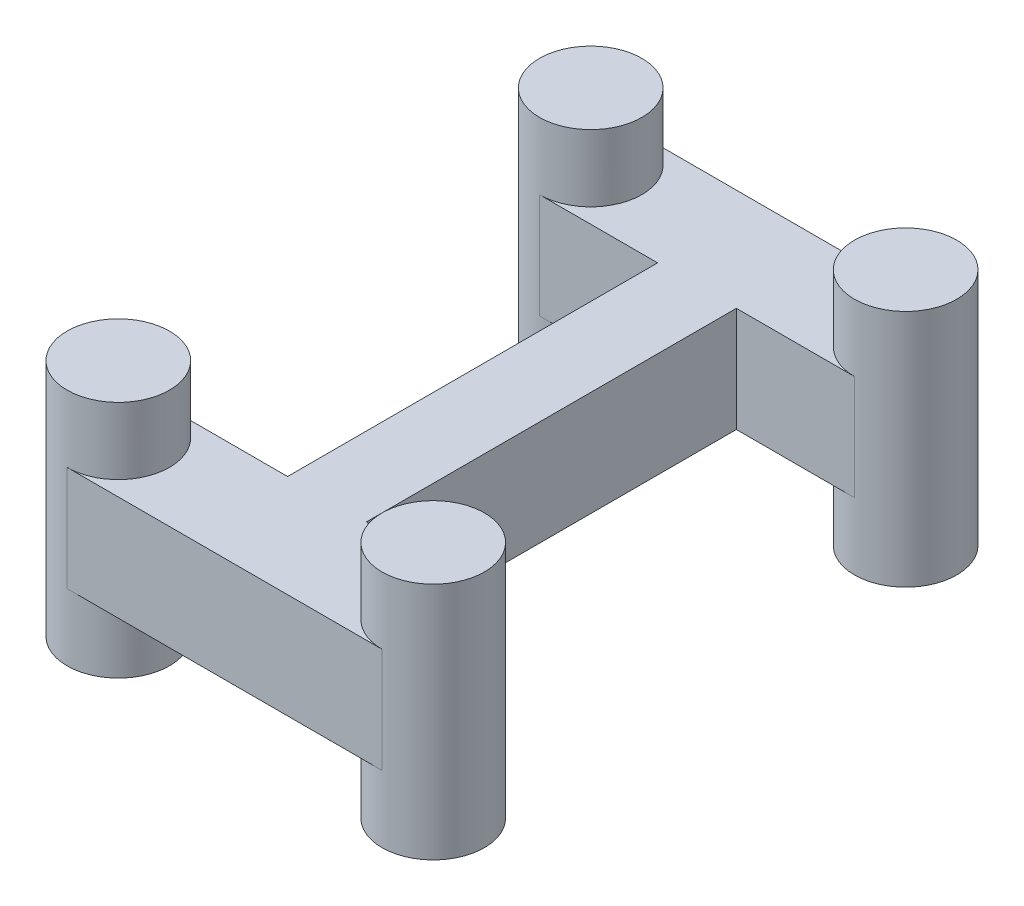
ISO-10303-21;
HEADER;
FILE_DESCRIPTION(('STEP AP214'),'2;1');
FILE_NAME('part.step','',(''),(''),'','','');
FILE_SCHEMA(('AUTOMOTIVE_DESIGN { 1 0 10303 214 1 1 1 1 }'));
ENDSEC;
DATA;
#1=APPLICATION_CONTEXT('core data for automotive mechanical design processes');
#2=APPLICATION_PROTOCOL_DEFINITION('international standard','automotive_design',2000,#1);
#3=PRODUCT_CONTEXT('',#1,'mechanical');
#4=PRODUCT('Part','Part','',(#3));
#5=PRODUCT_RELATED_PRODUCT_CATEGORY('part','',(#4));
#6=PRODUCT_DEFINITION_FORMATION('','',#4);
#7=PRODUCT_DEFINITION_CONTEXT('part definition',#1,'design');
#8=PRODUCT_DEFINITION('design','',#6,#7);
#9=PRODUCT_DEFINITION_SHAPE('','',#8);
#10=(LENGTH_UNIT() NAMED_UNIT(*) SI_UNIT(.MILLI.,.METRE.));
#11=(NAMED_UNIT(*) PLANE_ANGLE_UNIT() SI_UNIT($,.RADIAN.));
#12=(NAMED_UNIT(*) SI_UNIT($,.STERADIAN.) SOLID_ANGLE_UNIT());
#13=UNCERTAINTY_MEASURE_WITH_UNIT(LENGTH_MEASURE(1.E-05),#10,'distance_accuracy_value','');
#14=(GEOMETRIC_REPRESENTATION_CONTEXT(3) GLOBAL_UNCERTAINTY_ASSIGNED_CONTEXT((#13)) GLOBAL_UNIT_ASSIGNED_CONTEXT((#10,
#11,#12)) REPRESENTATION_CONTEXT('',''));
#15=CARTESIAN_POINT('',(0.,0.,0.));
#16=DIRECTION('',(0.,0.,1.));
#17=DIRECTION('',(1.,0.,0.));
#18=AXIS2_PLACEMENT_3D('',#15,#16,#17);
#19=CARTESIAN_POINT('',(0.,-2.,7.05));
#20=DIRECTION('',(0.,0.,-1.));
#21=DIRECTION('',(-1.,0.,0.));
#22=AXIS2_PLACEMENT_3D('',#19,#20,#21);
#23=PLANE('',#22);
#24=DIRECTION('',(0.,1.,0.));
#25=VECTOR('',#24,1.);
#26=CARTESIAN_POINT('',(-6.,-2.,7.05));
#27=LINE('',#26,#25);
#28=CARTESIAN_POINT('',(-6.,-2.,7.05));
#29=VERTEX_POINT('',#28);
#30=CARTESIAN_POINT('',(-6.,2.,7.05));
#31=VERTEX_POINT('',#30);
#32=EDGE_CURVE('E11',#29,#31,#27,.T.);
#33=ORIENTED_EDGE('',*,*,#32,.T.);
#34=DIRECTION('',(-1.,0.,0.));
#35=VECTOR('',#34,1.);
#36=CARTESIAN_POINT('',(0.,2.,7.05));
#37=LINE('',#36,#35);
#38=CARTESIAN_POINT('',(-1.5,2.,7.05));
#39=VERTEX_POINT('',#38);
#40=EDGE_CURVE('E189',#39,#31,#37,.T.);
#41=ORIENTED_EDGE('',*,*,#40,.F.);
#42=DIRECTION('',(0.,1.,0.));
#43=VECTOR('',#42,1.);
#44=CARTESIAN_POINT('',(-1.5,-2.,7.05));
#45=LINE('',#44,#43);
#46=CARTESIAN_POINT('',(-1.5,-2.,7.05));
#47=VERTEX_POINT('',#46);
#48=EDGE_CURVE('E51',#47,#39,#45,.T.);
#49=ORIENTED_EDGE('',*,*,#48,.F.);
#50=DIRECTION('',(-1.,0.,0.));
#51=VECTOR('',#50,1.);
#52=CARTESIAN_POINT('',(0.,-2.,7.05));
#53=LINE('',#52,#51);
#54=EDGE_CURVE('E228',#47,#29,#53,.T.);
#55=ORIENTED_EDGE('',*,*,#54,.T.);
#56=EDGE_LOOP('',(#33,#41,#49,#55));
#57=FACE_BOUND('',#56,.T.);
#58=ADVANCED_FACE('F41',(#57),#23,.T.);
#59=CARTESIAN_POINT('',(-1.5,-2.,0.));
#60=DIRECTION('',(-1.,0.,0.));
#61=DIRECTION('',(0.,0.,1.));
#62=AXIS2_PLACEMENT_3D('',#59,#60,#61);
#63=PLANE('',#62);
#64=ORIENTED_EDGE('',*,*,#48,.T.);
#65=DIRECTION('',(0.,0.,1.));
#66=VECTOR('',#65,1.);
#67=CARTESIAN_POINT('',(-1.5,2.,0.));
#68=LINE('',#67,#66);
#69=CARTESIAN_POINT('',(-1.5,2.,-7.05));
#70=VERTEX_POINT('',#69);
#71=EDGE_CURVE('E185',#70,#39,#68,.T.);
#72=ORIENTED_EDGE('',*,*,#71,.F.);
#73=DIRECTION('',(0.,1.,0.));
#74=VECTOR('',#73,1.);
#75=CARTESIAN_POINT('',(-1.5,-2.,-7.05));
#76=LINE('',#75,#74);
#77=CARTESIAN_POINT('',(-1.5,-2.,-7.05));
#78=VERTEX_POINT('',#77);
#79=EDGE_CURVE('E233',#78,#70,#76,.T.);
#80=ORIENTED_EDGE('',*,*,#79,.F.);
#81=DIRECTION('',(0.,0.,1.));
#82=VECTOR('',#81,1.);
#83=CARTESIAN_POINT('',(-1.5,-2.,0.));
#84=LINE('',#83,#82);
#85=EDGE_CURVE('E225',#78,#47,#84,.T.);
#86=ORIENTED_EDGE('',*,*,#85,.T.);
#87=EDGE_LOOP('',(#64,#72,#80,#86));
#88=FACE_BOUND('',#87,.T.);
#89=ADVANCED_FACE('F293',(#88),#63,.T.);
#90=CARTESIAN_POINT('',(0.,-2.,-7.05));
#91=DIRECTION('',(0.,0.,1.));
#92=DIRECTION('',(1.,0.,0.));
#93=AXIS2_PLACEMENT_3D('',#90,#91,#92);
#94=PLANE('',#93);
#95=ORIENTED_EDGE('',*,*,#79,.T.);
#96=DIRECTION('',(1.,0.,0.));
#97=VECTOR('',#96,1.);
#98=CARTESIAN_POINT('',(0.,2.,-7.05));
#99=LINE('',#98,#97);
#100=CARTESIAN_POINT('',(-6.,2.,-7.05));
#101=VERTEX_POINT('',#100);
#102=EDGE_CURVE('E181',#101,#70,#99,.T.);
#103=ORIENTED_EDGE('',*,*,#102,.F.);
#104=DIRECTION('',(0.,1.,0.));
#105=VECTOR('',#104,1.);
#106=CARTESIAN_POINT('',(-6.,-2.,-7.05));
#107=LINE('',#106,#105);
#108=CARTESIAN_POINT('',(-6.,-2.,-7.05));
#109=VERTEX_POINT('',#108);
#110=EDGE_CURVE('E236',#109,#101,#107,.T.);
#111=ORIENTED_EDGE('',*,*,#110,.F.);
#112=DIRECTION('',(1.,0.,0.));
#113=VECTOR('',#112,1.);
#114=CARTESIAN_POINT('',(0.,-2.,-7.05));
#115=LINE('',#114,#113);
#116=EDGE_CURVE('E221',#109,#78,#115,.T.);
#117=ORIENTED_EDGE('',*,*,#116,.T.);
#118=EDGE_LOOP('',(#95,#103,#111,#117));
#119=FACE_BOUND('',#118,.T.);
#120=ADVANCED_FACE('F290',(#119),#94,.T.);
#121=CARTESIAN_POINT('',(0.,-2.,-10.95));
#122=DIRECTION('',(0.,0.,-1.));
#123=DIRECTION('',(-1.,0.,0.));
#124=AXIS2_PLACEMENT_3D('',#121,#122,#123);
#125=PLANE('',#124);
#126=DIRECTION('',(0.,1.,0.));
#127=VECTOR('',#126,1.);
#128=CARTESIAN_POINT('',(-6.,-2.,-10.95));
#129=LINE('',#128,#127);
#130=CARTESIAN_POINT('',(-6.,-2.,-10.95));
#131=VERTEX_POINT('',#130);
#132=CARTESIAN_POINT('',(-6.,2.,-10.95));
#133=VERTEX_POINT('',#132);
#134=EDGE_CURVE('E240',#131,#133,#129,.T.);
#135=ORIENTED_EDGE('',*,*,#134,.T.);
#136=DIRECTION('',(-1.,0.,0.));
#137=VECTOR('',#136,1.);
#138=CARTESIAN_POINT('',(0.,2.,-10.95));
#139=LINE('',#138,#137);
#140=CARTESIAN_POINT('',(6.,2.,-10.95));
#141=VERTEX_POINT('',#140);
#142=EDGE_CURVE('E174',#141,#133,#139,.T.);
#143=ORIENTED_EDGE('',*,*,#142,.F.);
#144=DIRECTION('',(0.,1.,0.));
#145=VECTOR('',#144,1.);
#146=CARTESIAN_POINT('',(6.,-2.,-10.95));
#147=LINE('',#146,#145);
#148=CARTESIAN_POINT('',(6.,-2.,-10.95));
#149=VERTEX_POINT('',#148);
#150=EDGE_CURVE('E244',#149,#141,#147,.T.);
#151=ORIENTED_EDGE('',*,*,#150,.F.);
#152=DIRECTION('',(-1.,0.,0.));
#153=VECTOR('',#152,1.);
#154=CARTESIAN_POINT('',(0.,-2.,-10.95));
#155=LINE('',#154,#153);
#156=EDGE_CURVE('E214',#149,#131,#155,.T.);
#157=ORIENTED_EDGE('',*,*,#156,.T.);
#158=EDGE_LOOP('',(#135,#143,#151,#157));
#159=FACE_BOUND('',#158,.T.);
#160=ADVANCED_FACE('F284',(#159),#125,.T.);
#161=CARTESIAN_POINT('',(0.,-2.,-7.05));
#162=DIRECTION('',(0.,0.,1.));
#163=DIRECTION('',(1.,0.,0.));
#164=AXIS2_PLACEMENT_3D('',#161,#162,#163);
#165=PLANE('',#164);
#166=DIRECTION('',(0.,1.,0.));
#167=VECTOR('',#166,1.);
#168=CARTESIAN_POINT('',(6.,-2.,-7.05));
#169=LINE('',#168,#167);
#170=CARTESIAN_POINT('',(6.,-2.,-7.05));
#171=VERTEX_POINT('',#170);
#172=CARTESIAN_POINT('',(6.,2.,-7.05));
#173=VERTEX_POINT('',#172);
#174=EDGE_CURVE('E248',#171,#173,#169,.T.);
#175=ORIENTED_EDGE('',*,*,#174,.T.);
#176=DIRECTION('',(1.,0.,0.));
#177=VECTOR('',#176,1.);
#178=CARTESIAN_POINT('',(0.,2.,-7.05));
#179=LINE('',#178,#177);
#180=CARTESIAN_POINT('',(1.5,2.,-7.05));
#181=VERTEX_POINT('',#180);
#182=EDGE_CURVE('E167',#181,#173,#179,.T.);
#183=ORIENTED_EDGE('',*,*,#182,.F.);
#184=DIRECTION('',(0.,1.,0.));
#185=VECTOR('',#184,1.);
#186=CARTESIAN_POINT('',(1.5,-2.,-7.05));
#187=LINE('',#186,#185);
#188=CARTESIAN_POINT('',(1.5,-2.,-7.05));
#189=VERTEX_POINT('',#188);
#190=EDGE_CURVE('E252',#189,#181,#187,.T.);
#191=ORIENTED_EDGE('',*,*,#190,.F.);
#192=DIRECTION('',(1.,0.,0.));
#193=VECTOR('',#192,1.);
#194=CARTESIAN_POINT('',(0.,-2.,-7.05));
#195=LINE('',#194,#193);
#196=EDGE_CURVE('E207',#189,#171,#195,.T.);
#197=ORIENTED_EDGE('',*,*,#196,.T.);
#198=EDGE_LOOP('',(#175,#183,#191,#197));
#199=FACE_BOUND('',#198,.T.);
#200=ADVANCED_FACE('F274',(#199),#165,.T.);
#201=CARTESIAN_POINT('',(1.5,-2.,0.));
#202=DIRECTION('',(1.,0.,0.));
#203=DIRECTION('',(0.,0.,-1.));
#204=AXIS2_PLACEMENT_3D('',#201,#202,#203);
#205=PLANE('',#204);
#206=ORIENTED_EDGE('',*,*,#190,.T.);
#207=DIRECTION('',(0.,0.,-1.));
#208=VECTOR('',#207,1.);
#209=CARTESIAN_POINT('',(1.5,2.,0.));
#210=LINE('',#209,#208);
#211=CARTESIAN_POINT('',(1.5,2.,7.05));
#212=VERTEX_POINT('',#211);
#213=EDGE_CURVE('E160',#212,#181,#210,.T.);
#214=ORIENTED_EDGE('',*,*,#213,.F.);
#215=DIRECTION('',(0.,1.,0.));
#216=VECTOR('',#215,1.);
#217=CARTESIAN_POINT('',(1.5,-2.,7.05));
#218=LINE('',#217,#216);
#219=CARTESIAN_POINT('',(1.5,-2.,7.05));
#220=VERTEX_POINT('',#219);
#221=EDGE_CURVE('E255',#220,#212,#218,.T.);
#222=ORIENTED_EDGE('',*,*,#221,.F.);
#223=DIRECTION('',(0.,0.,-1.));
#224=VECTOR('',#223,1.);
#225=CARTESIAN_POINT('',(1.5,-2.,0.));
#226=LINE('',#225,#224);
#227=EDGE_CURVE('E203',#220,#189,#226,.T.);
#228=ORIENTED_EDGE('',*,*,#227,.T.);
#229=EDGE_LOOP('',(#206,#214,#222,#228));
#230=FACE_BOUND('',#229,.T.);
#231=ADVANCED_FACE('F272',(#230),#205,.T.);
#232=CARTESIAN_POINT('',(0.,-2.,7.05));
#233=DIRECTION('',(0.,0.,-1.));
#234=DIRECTION('',(-1.,0.,0.));
#235=AXIS2_PLACEMENT_3D('',#232,#233,#234);
#236=PLANE('',#235);
#237=ORIENTED_EDGE('',*,*,#221,.T.);
#238=DIRECTION('',(-1.,0.,0.));
#239=VECTOR('',#238,1.);
#240=CARTESIAN_POINT('',(0.,2.,7.05));
#241=LINE('',#240,#239);
#242=CARTESIAN_POINT('',(6.,2.,7.05));
#243=VERTEX_POINT('',#242);
#244=EDGE_CURVE('E157',#243,#212,#241,.T.);
#245=ORIENTED_EDGE('',*,*,#244,.F.);
#246=DIRECTION('',(0.,1.,0.));
#247=VECTOR('',#246,1.);
#248=CARTESIAN_POINT('',(6.,-2.,7.05));
#249=LINE('',#248,#247);
#250=CARTESIAN_POINT('',(6.,-2.,7.05));
#251=VERTEX_POINT('',#250);
#252=EDGE_CURVE('E154',#251,#243,#249,.T.);
#253=ORIENTED_EDGE('',*,*,#252,.F.);
#254=DIRECTION('',(-1.,0.,0.));
#255=VECTOR('',#254,1.);
#256=CARTESIAN_POINT('',(0.,-2.,7.05));
#257=LINE('',#256,#255);
#258=EDGE_CURVE('E199',#251,#220,#257,.T.);
#259=ORIENTED_EDGE('',*,*,#258,.T.);
#260=EDGE_LOOP('',(#237,#245,#253,#259));
#261=FACE_BOUND('',#260,.T.);
#262=ADVANCED_FACE('F268',(#261),#236,.T.);
#263=CARTESIAN_POINT('',(0.,-2.,10.95));
#264=DIRECTION('',(0.,0.,1.));
#265=DIRECTION('',(1.,0.,0.));
#266=AXIS2_PLACEMENT_3D('',#263,#264,#265);
#267=PLANE('',#266);
#268=DIRECTION('',(0.,1.,0.));
#269=VECTOR('',#268,1.);
#270=CARTESIAN_POINT('',(6.,-2.,10.95));
#271=LINE('',#270,#269);
#272=CARTESIAN_POINT('',(6.,-2.,10.95));
#273=VERTEX_POINT('',#272);
#274=CARTESIAN_POINT('',(6.,2.,10.95));
#275=VERTEX_POINT('',#274);
#276=EDGE_CURVE('E149',#273,#275,#271,.T.);
#277=ORIENTED_EDGE('',*,*,#276,.T.);
#278=DIRECTION('',(1.,0.,0.));
#279=VECTOR('',#278,1.);
#280=CARTESIAN_POINT('',(0.,2.,10.95));
#281=LINE('',#280,#279);
#282=CARTESIAN_POINT('',(-6.,2.,10.95));
#283=VERTEX_POINT('',#282);
#284=EDGE_CURVE('E134',#283,#275,#281,.T.);
#285=ORIENTED_EDGE('',*,*,#284,.F.);
#286=DIRECTION('',(0.,1.,0.));
#287=VECTOR('',#286,1.);
#288=CARTESIAN_POINT('',(-6.,-2.,10.95));
#289=LINE('',#288,#287);
#290=CARTESIAN_POINT('',(-6.,-2.,10.95));
#291=VERTEX_POINT('',#290);
#292=EDGE_CURVE('E45',#291,#283,#289,.T.);
#293=ORIENTED_EDGE('',*,*,#292,.F.);
#294=DIRECTION('',(1.,0.,0.));
#295=VECTOR('',#294,1.);
#296=CARTESIAN_POINT('',(0.,-2.,10.95));
#297=LINE('',#296,#295);
#298=EDGE_CURVE('E150',#291,#273,#297,.T.);
#299=ORIENTED_EDGE('',*,*,#298,.T.);
#300=EDGE_LOOP('',(#277,#285,#293,#299));
#301=FACE_BOUND('',#300,.T.);
#302=ADVANCED_FACE('F43',(#301),#267,.T.);
#303=CARTESIAN_POINT('',(0.,-2.,0.));
#304=DIRECTION('',(0.,1.,0.));
#305=DIRECTION('',(0.,0.,1.));
#306=AXIS2_PLACEMENT_3D('',#303,#304,#305);
#307=PLANE('',#306);
#308=CARTESIAN_POINT('',(-6.,-2.,9.));
#309=DIRECTION('',(0.,1.,0.));
#310=DIRECTION('',(0.,0.,1.));
#311=AXIS2_PLACEMENT_3D('',#308,#309,#310);
#312=CIRCLE('',#311,1.95);
#313=EDGE_CURVE('E59',#291,#29,#312,.T.);
#314=ORIENTED_EDGE('',*,*,#313,.T.);
#315=ORIENTED_EDGE('',*,*,#54,.F.);
#316=ORIENTED_EDGE('',*,*,#85,.F.);
#317=ORIENTED_EDGE('',*,*,#116,.F.);
#318=CARTESIAN_POINT('',(-6.,-2.,-9.));
#319=DIRECTION('',(0.,1.,0.));
#320=DIRECTION('',(0.,0.,1.));
#321=AXIS2_PLACEMENT_3D('',#318,#319,#320);
#322=CIRCLE('',#321,1.95);
#323=EDGE_CURVE('E218',#109,#131,#322,.T.);
#324=ORIENTED_EDGE('',*,*,#323,.T.);
#325=ORIENTED_EDGE('',*,*,#156,.F.);
#326=CARTESIAN_POINT('',(6.,-2.,-9.));
#327=DIRECTION('',(0.,1.,0.));
#328=DIRECTION('',(0.,0.,1.));
#329=AXIS2_PLACEMENT_3D('',#326,#327,#328);
#330=CIRCLE('',#329,1.95);
#331=EDGE_CURVE('E211',#149,#171,#330,.T.);
#332=ORIENTED_EDGE('',*,*,#331,.T.);
#333=ORIENTED_EDGE('',*,*,#196,.F.);
#334=ORIENTED_EDGE('',*,*,#227,.F.);
#335=ORIENTED_EDGE('',*,*,#258,.F.);
#336=CARTESIAN_POINT('',(6.,-2.,9.));
#337=DIRECTION('',(0.,1.,0.));
#338=DIRECTION('',(0.,0.,1.));
#339=AXIS2_PLACEMENT_3D('',#336,#337,#338);
#340=CIRCLE('',#339,1.95);
#341=EDGE_CURVE('E196',#251,#273,#340,.T.);
#342=ORIENTED_EDGE('',*,*,#341,.T.);
#343=ORIENTED_EDGE('',*,*,#298,.F.);
#344=EDGE_LOOP('',(#314,#315,#316,#317,#324,#325,#332,#333,#334,#335,#342,#343));
#345=FACE_BOUND('',#344,.T.);
#346=ADVANCED_FACE('F263',(#345),#307,.F.);
#347=CARTESIAN_POINT('',(0.,2.,0.));
#348=DIRECTION('',(0.,1.,0.));
#349=DIRECTION('',(0.,0.,1.));
#350=AXIS2_PLACEMENT_3D('',#347,#348,#349);
#351=PLANE('',#350);
#352=CARTESIAN_POINT('',(-6.,2.,9.));
#353=DIRECTION('',(0.,1.,0.));
#354=DIRECTION('',(0.,0.,1.));
#355=AXIS2_PLACEMENT_3D('',#352,#353,#354);
#356=CIRCLE('',#355,1.95);
#357=EDGE_CURVE('E142',#283,#31,#356,.T.);
#358=ORIENTED_EDGE('',*,*,#357,.F.);
#359=ORIENTED_EDGE('',*,*,#284,.T.);
#360=CARTESIAN_POINT('',(6.,2.,9.));
#361=DIRECTION('',(0.,1.,0.));
#362=DIRECTION('',(0.,0.,1.));
#363=AXIS2_PLACEMENT_3D('',#360,#361,#362);
#364=CIRCLE('',#363,1.95);
#365=EDGE_CURVE('E139',#243,#275,#364,.T.);
#366=ORIENTED_EDGE('',*,*,#365,.F.);
#367=ORIENTED_EDGE('',*,*,#244,.T.);
#368=ORIENTED_EDGE('',*,*,#213,.T.);
#369=ORIENTED_EDGE('',*,*,#182,.T.);
#370=CARTESIAN_POINT('',(6.,2.,-9.));
#371=DIRECTION('',(0.,1.,0.));
#372=DIRECTION('',(0.,0.,1.));
#373=AXIS2_PLACEMENT_3D('',#370,#371,#372);
#374=CIRCLE('',#373,1.95);
#375=EDGE_CURVE('E170',#141,#173,#374,.T.);
#376=ORIENTED_EDGE('',*,*,#375,.F.);
#377=ORIENTED_EDGE('',*,*,#142,.T.);
#378=CARTESIAN_POINT('',(-6.,2.,-9.));
#379=DIRECTION('',(0.,1.,0.));
#380=DIRECTION('',(0.,0.,1.));
#381=AXIS2_PLACEMENT_3D('',#378,#379,#380);
#382=CIRCLE('',#381,1.95);
#383=EDGE_CURVE('E177',#101,#133,#382,.T.);
#384=ORIENTED_EDGE('',*,*,#383,.F.);
#385=ORIENTED_EDGE('',*,*,#102,.T.);
#386=ORIENTED_EDGE('',*,*,#71,.T.);
#387=ORIENTED_EDGE('',*,*,#40,.T.);
#388=EDGE_LOOP('',(#358,#359,#366,#367,#368,#369,#376,#377,#384,#385,#386,#387));
#389=FACE_BOUND('',#388,.T.);
#390=ADVANCED_FACE('F136',(#389),#351,.T.);
#391=CARTESIAN_POINT('',(-6.,-4.55,-9.));
#392=DIRECTION('',(0.,1.,0.));
#393=DIRECTION('',(0.,0.,1.));
#394=AXIS2_PLACEMENT_3D('',#391,#392,#393);
#395=CYLINDRICAL_SURFACE('',#394,1.95);
#396=CARTESIAN_POINT('',(-6.,4.55,-9.));
#397=DIRECTION('',(0.,1.,0.));
#398=DIRECTION('',(0.,0.,1.));
#399=AXIS2_PLACEMENT_3D('',#396,#397,#398);
#400=CIRCLE('',#399,1.95);
#401=CARTESIAN_POINT('',(-6.,4.55,-7.05));
#402=VERTEX_POINT('',#401);
#403=EDGE_CURVE('E395',#402,#402,#400,.T.);
#404=ORIENTED_EDGE('',*,*,#403,.F.);
#405=EDGE_LOOP('',(#404));
#406=FACE_BOUND('',#405,.T.);
#407=CARTESIAN_POINT('',(-6.,-4.55,-9.));
#408=DIRECTION('',(0.,1.,0.));
#409=DIRECTION('',(0.,0.,1.));
#410=AXIS2_PLACEMENT_3D('',#407,#408,#409);
#411=CIRCLE('',#410,1.95);
#412=CARTESIAN_POINT('',(-6.,-4.55,-7.05));
#413=VERTEX_POINT('',#412);
#414=EDGE_CURVE('E399',#413,#413,#411,.T.);
#415=ORIENTED_EDGE('',*,*,#414,.T.);
#416=EDGE_LOOP('',(#415));
#417=FACE_BOUND('',#416,.T.);
#418=ORIENTED_EDGE('',*,*,#323,.F.);
#419=ORIENTED_EDGE('',*,*,#110,.T.);
#420=ORIENTED_EDGE('',*,*,#383,.T.);
#421=ORIENTED_EDGE('',*,*,#134,.F.);
#422=EDGE_LOOP('',(#418,#419,#420,#421));
#423=FACE_BOUND('',#422,.T.);
#424=ADVANCED_FACE('F287',(#406,#417,#423),#395,.T.);
#425=CARTESIAN_POINT('',(0.,-4.55,0.));
#426=DIRECTION('',(0.,1.,0.));
#427=DIRECTION('',(0.,0.,1.));
#428=AXIS2_PLACEMENT_3D('',#425,#426,#427);
#429=PLANE('',#428);
#430=ORIENTED_EDGE('',*,*,#414,.F.);
#431=EDGE_LOOP('',(#430));
#432=FACE_BOUND('',#431,.T.);
#433=ADVANCED_FACE('F324',(#432),#429,.F.);
#434=CARTESIAN_POINT('',(0.,4.55,0.));
#435=DIRECTION('',(0.,1.,0.));
#436=DIRECTION('',(0.,0.,1.));
#437=AXIS2_PLACEMENT_3D('',#434,#435,#436);
#438=PLANE('',#437);
#439=ORIENTED_EDGE('',*,*,#403,.T.);
#440=EDGE_LOOP('',(#439));
#441=FACE_BOUND('',#440,.T.);
#442=ADVANCED_FACE('F330',(#441),#438,.T.);
#443=CARTESIAN_POINT('',(6.,-4.55,-9.));
#444=DIRECTION('',(0.,1.,0.));
#445=DIRECTION('',(0.,0.,1.));
#446=AXIS2_PLACEMENT_3D('',#443,#444,#445);
#447=CYLINDRICAL_SURFACE('',#446,1.95);
#448=CARTESIAN_POINT('',(6.,4.55,-9.));
#449=DIRECTION('',(0.,1.,0.));
#450=DIRECTION('',(0.,0.,1.));
#451=AXIS2_PLACEMENT_3D('',#448,#449,#450);
#452=CIRCLE('',#451,1.95);
#453=CARTESIAN_POINT('',(6.,4.55,-7.05));
#454=VERTEX_POINT('',#453);
#455=EDGE_CURVE('E387',#454,#454,#452,.T.);
#456=ORIENTED_EDGE('',*,*,#455,.F.);
#457=EDGE_LOOP('',(#456));
#458=FACE_BOUND('',#457,.T.);
#459=CARTESIAN_POINT('',(6.,-4.55,-9.));
#460=DIRECTION('',(0.,1.,0.));
#461=DIRECTION('',(0.,0.,1.));
#462=AXIS2_PLACEMENT_3D('',#459,#460,#461);
#463=CIRCLE('',#462,1.95);
#464=CARTESIAN_POINT('',(6.,-4.55,-7.05));
#465=VERTEX_POINT('',#464);
#466=EDGE_CURVE('E391',#465,#465,#463,.T.);
#467=ORIENTED_EDGE('',*,*,#466,.T.);
#468=EDGE_LOOP('',(#467));
#469=FACE_BOUND('',#468,.T.);
#470=ORIENTED_EDGE('',*,*,#331,.F.);
#471=ORIENTED_EDGE('',*,*,#150,.T.);
#472=ORIENTED_EDGE('',*,*,#375,.T.);
#473=ORIENTED_EDGE('',*,*,#174,.F.);
#474=EDGE_LOOP('',(#470,#471,#472,#473));
#475=FACE_BOUND('',#474,.T.);
#476=ADVANCED_FACE('F279',(#458,#469,#475),#447,.T.);
#477=CARTESIAN_POINT('',(0.,-4.55,0.));
#478=DIRECTION('',(0.,1.,0.));
#479=DIRECTION('',(0.,0.,1.));
#480=AXIS2_PLACEMENT_3D('',#477,#478,#479);
#481=PLANE('',#480);
#482=ORIENTED_EDGE('',*,*,#466,.F.);
#483=EDGE_LOOP('',(#482));
#484=FACE_BOUND('',#483,.T.);
#485=ADVANCED_FACE('F337',(#484),#481,.F.);
#486=CARTESIAN_POINT('',(0.,4.55,0.));
#487=DIRECTION('',(0.,1.,0.));
#488=DIRECTION('',(0.,0.,1.));
#489=AXIS2_PLACEMENT_3D('',#486,#487,#488);
#490=PLANE('',#489);
#491=ORIENTED_EDGE('',*,*,#455,.T.);
#492=EDGE_LOOP('',(#491));
#493=FACE_BOUND('',#492,.T.);
#494=ADVANCED_FACE('F341',(#493),#490,.T.);
#495=CARTESIAN_POINT('',(-6.,-4.55,9.));
#496=DIRECTION('',(0.,1.,0.));
#497=DIRECTION('',(0.,0.,1.));
#498=AXIS2_PLACEMENT_3D('',#495,#496,#497);
#499=CYLINDRICAL_SURFACE('',#498,1.95);
#500=CARTESIAN_POINT('',(-6.,4.55,9.));
#501=DIRECTION('',(0.,1.,0.));
#502=DIRECTION('',(0.,0.,1.));
#503=AXIS2_PLACEMENT_3D('',#500,#501,#502);
#504=CIRCLE('',#503,1.95);
#505=CARTESIAN_POINT('',(-6.,4.55,10.95));
#506=VERTEX_POINT('',#505);
#507=EDGE_CURVE('E377',#506,#506,#504,.T.);
#508=ORIENTED_EDGE('',*,*,#507,.F.);
#509=EDGE_LOOP('',(#508));
#510=FACE_BOUND('',#509,.T.);
#511=CARTESIAN_POINT('',(-6.,-4.55,9.));
#512=DIRECTION('',(0.,1.,0.));
#513=DIRECTION('',(0.,0.,1.));
#514=AXIS2_PLACEMENT_3D('',#511,#512,#513);
#515=CIRCLE('',#514,1.95);
#516=CARTESIAN_POINT('',(-6.,-4.55,10.95));
#517=VERTEX_POINT('',#516);
#518=EDGE_CURVE('E383',#517,#517,#515,.T.);
#519=ORIENTED_EDGE('',*,*,#518,.T.);
#520=EDGE_LOOP('',(#519));
#521=FACE_BOUND('',#520,.T.);
#522=ORIENTED_EDGE('',*,*,#313,.F.);
#523=ORIENTED_EDGE('',*,*,#292,.T.);
#524=ORIENTED_EDGE('',*,*,#357,.T.);
#525=ORIENTED_EDGE('',*,*,#32,.F.);
#526=EDGE_LOOP('',(#522,#523,#524,#525));
#527=FACE_BOUND('',#526,.T.);
#528=ADVANCED_FACE('F261',(#510,#521,#527),#499,.T.);
#529=CARTESIAN_POINT('',(0.,-4.55,0.));
#530=DIRECTION('',(0.,1.,0.));
#531=DIRECTION('',(0.,0.,1.));
#532=AXIS2_PLACEMENT_3D('',#529,#530,#531);
#533=PLANE('',#532);
#534=ORIENTED_EDGE('',*,*,#518,.F.);
#535=EDGE_LOOP('',(#534));
#536=FACE_BOUND('',#535,.T.);
#537=ADVANCED_FACE('F348',(#536),#533,.F.);
#538=CARTESIAN_POINT('',(0.,4.55,0.));
#539=DIRECTION('',(0.,1.,0.));
#540=DIRECTION('',(0.,0.,1.));
#541=AXIS2_PLACEMENT_3D('',#538,#539,#540);
#542=PLANE('',#541);
#543=ORIENTED_EDGE('',*,*,#507,.T.);
#544=EDGE_LOOP('',(#543));
#545=FACE_BOUND('',#544,.T.);
#546=ADVANCED_FACE('F352',(#545),#542,.T.);
#547=CARTESIAN_POINT('',(6.,-4.55,9.));
#548=DIRECTION('',(0.,1.,0.));
#549=DIRECTION('',(0.,0.,1.));
#550=AXIS2_PLACEMENT_3D('',#547,#548,#549);
#551=CYLINDRICAL_SURFACE('',#550,1.95);
#552=CARTESIAN_POINT('',(6.,4.55,9.));
#553=DIRECTION('',(0.,1.,0.));
#554=DIRECTION('',(0.,0.,1.));
#555=AXIS2_PLACEMENT_3D('',#552,#553,#554);
#556=CIRCLE('',#555,1.95);
#557=CARTESIAN_POINT('',(6.,4.55,10.95));
#558=VERTEX_POINT('',#557);
#559=EDGE_CURVE('E371',#558,#558,#556,.T.);
#560=ORIENTED_EDGE('',*,*,#559,.F.);
#561=EDGE_LOOP('',(#560));
#562=FACE_BOUND('',#561,.T.);
#563=CARTESIAN_POINT('',(6.,-4.55,9.));
#564=DIRECTION('',(0.,1.,0.));
#565=DIRECTION('',(0.,0.,1.));
#566=AXIS2_PLACEMENT_3D('',#563,#564,#565);
#567=CIRCLE('',#566,1.95);
#568=CARTESIAN_POINT('',(6.,-4.55,10.95));
#569=VERTEX_POINT('',#568);
#570=EDGE_CURVE('E373',#569,#569,#567,.T.);
#571=ORIENTED_EDGE('',*,*,#570,.T.);
#572=EDGE_LOOP('',(#571));
#573=FACE_BOUND('',#572,.T.);
#574=ORIENTED_EDGE('',*,*,#341,.F.);
#575=ORIENTED_EDGE('',*,*,#252,.T.);
#576=ORIENTED_EDGE('',*,*,#365,.T.);
#577=ORIENTED_EDGE('',*,*,#276,.F.);
#578=EDGE_LOOP('',(#574,#575,#576,#577));
#579=FACE_BOUND('',#578,.T.);
#580=ADVANCED_FACE('F155',(#562,#573,#579),#551,.T.);
#581=CARTESIAN_POINT('',(0.,-4.55,0.));
#582=DIRECTION('',(0.,1.,0.));
#583=DIRECTION('',(0.,0.,1.));
#584=AXIS2_PLACEMENT_3D('',#581,#582,#583);
#585=PLANE('',#584);
#586=ORIENTED_EDGE('',*,*,#570,.F.);
#587=EDGE_LOOP('',(#586));
#588=FACE_BOUND('',#587,.T.);
#589=ADVANCED_FACE('F359',(#588),#585,.F.);
#590=CARTESIAN_POINT('',(0.,4.55,0.));
#591=DIRECTION('',(0.,1.,0.));
#592=DIRECTION('',(0.,0.,1.));
#593=AXIS2_PLACEMENT_3D('',#590,#591,#592);
#594=PLANE('',#593);
#595=ORIENTED_EDGE('',*,*,#559,.T.);
#596=EDGE_LOOP('',(#595));
#597=FACE_BOUND('',#596,.T.);
#598=ADVANCED_FACE('F363',(#597),#594,.T.);
#599=CLOSED_SHELL('',(#58,#89,#120,#160,#200,#231,#262,#302,#346,#390,#424,#433,#442,#476,#485,
#494,#528,#537,#546,#580,#589,#598));
#600=MANIFOLD_SOLID_BREP('B2',#599);
#601=ADVANCED_BREP_SHAPE_REPRESENTATION('',(#18,#600),#14);
#602=SHAPE_DEFINITION_REPRESENTATION(#9,#601);
ENDSEC;
END-ISO-10303-21;
